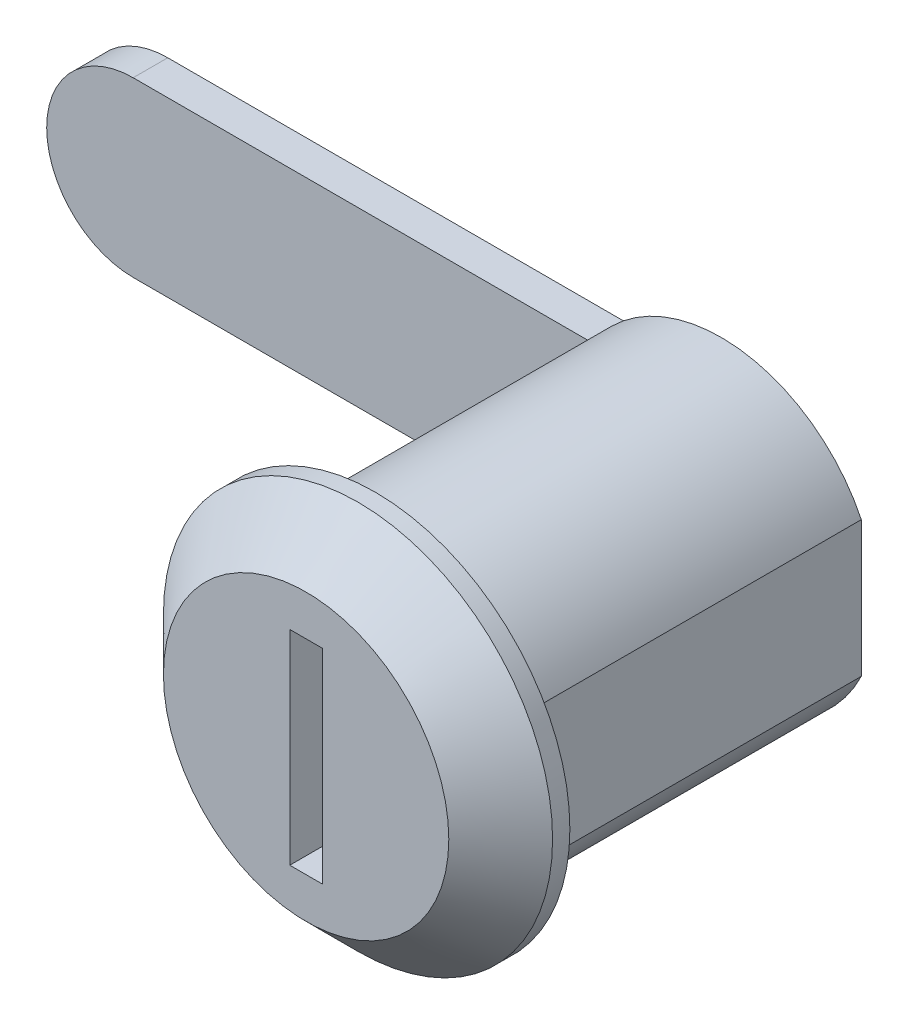
ISO-10303-21;
HEADER;
FILE_DESCRIPTION(('STEP AP214'),'2;1');
FILE_NAME('part.step','',(''),(''),'','','');
FILE_SCHEMA(('AUTOMOTIVE_DESIGN { 1 0 10303 214 1 1 1 1 }'));
ENDSEC;
DATA;
#1=APPLICATION_CONTEXT('core data for automotive mechanical design processes');
#2=APPLICATION_PROTOCOL_DEFINITION('international standard','automotive_design',2000,#1);
#3=PRODUCT_CONTEXT('',#1,'mechanical');
#4=PRODUCT('Part','Part','',(#3));
#5=PRODUCT_RELATED_PRODUCT_CATEGORY('part','',(#4));
#6=PRODUCT_DEFINITION_FORMATION('','',#4);
#7=PRODUCT_DEFINITION_CONTEXT('part definition',#1,'design');
#8=PRODUCT_DEFINITION('design','',#6,#7);
#9=PRODUCT_DEFINITION_SHAPE('','',#8);
#10=(LENGTH_UNIT() NAMED_UNIT(*) SI_UNIT(.MILLI.,.METRE.));
#11=(NAMED_UNIT(*) PLANE_ANGLE_UNIT() SI_UNIT($,.RADIAN.));
#12=(NAMED_UNIT(*) SI_UNIT($,.STERADIAN.) SOLID_ANGLE_UNIT());
#13=UNCERTAINTY_MEASURE_WITH_UNIT(LENGTH_MEASURE(1.E-05),#10,'distance_accuracy_value','');
#14=(GEOMETRIC_REPRESENTATION_CONTEXT(3) GLOBAL_UNCERTAINTY_ASSIGNED_CONTEXT((#13)) GLOBAL_UNIT_ASSIGNED_CONTEXT((#10,
#11,#12)) REPRESENTATION_CONTEXT('',''));
#15=CARTESIAN_POINT('',(0.,0.,0.));
#16=DIRECTION('',(0.,0.,1.));
#17=DIRECTION('',(1.,0.,0.));
#18=AXIS2_PLACEMENT_3D('',#15,#16,#17);
#19=CARTESIAN_POINT('',(0.,0.,0.));
#20=DIRECTION('',(0.,0.,1.));
#21=DIRECTION('',(1.,0.,0.));
#22=AXIS2_PLACEMENT_3D('',#19,#20,#21);
#23=PLANE('',#22);
#24=CARTESIAN_POINT('',(0.,0.,0.));
#25=DIRECTION('',(0.,0.,1.));
#26=DIRECTION('',(1.,0.,0.));
#27=AXIS2_PLACEMENT_3D('',#24,#25,#26);
#28=CIRCLE('',#27,11.25);
#29=CARTESIAN_POINT('',(11.25,0.,0.));
#30=VERTEX_POINT('',#29);
#31=EDGE_CURVE('E250',#30,#30,#28,.T.);
#32=ORIENTED_EDGE('',*,*,#31,.F.);
#33=EDGE_LOOP('',(#32));
#34=FACE_BOUND('',#33,.T.);
#35=CARTESIAN_POINT('',(0.,0.,0.));
#36=DIRECTION('',(0.,0.,-1.));
#37=DIRECTION('',(-1.,0.,0.));
#38=AXIS2_PLACEMENT_3D('',#35,#36,#37);
#39=CIRCLE('',#38,9.);
#40=CARTESIAN_POINT('',(8.1,-3.92300904918661,0.));
#41=VERTEX_POINT('',#40);
#42=CARTESIAN_POINT('',(-8.1,-3.92300904918661,0.));
#43=VERTEX_POINT('',#42);
#44=EDGE_CURVE('E161',#41,#43,#39,.T.);
#45=ORIENTED_EDGE('',*,*,#44,.F.);
#46=DIRECTION('',(0.,-1.,0.));
#47=VECTOR('',#46,1.);
#48=CARTESIAN_POINT('',(8.1,-3.92300904918661,0.));
#49=LINE('',#48,#47);
#50=CARTESIAN_POINT('',(8.1,3.92300904918661,0.));
#51=VERTEX_POINT('',#50);
#52=EDGE_CURVE('E196',#51,#41,#49,.T.);
#53=ORIENTED_EDGE('',*,*,#52,.F.);
#54=CARTESIAN_POINT('',(0.,0.,0.));
#55=DIRECTION('',(0.,0.,-1.));
#56=DIRECTION('',(-1.,0.,0.));
#57=AXIS2_PLACEMENT_3D('',#54,#55,#56);
#58=CIRCLE('',#57,9.);
#59=CARTESIAN_POINT('',(-8.1,3.92300904918661,0.));
#60=VERTEX_POINT('',#59);
#61=EDGE_CURVE('E192',#60,#51,#58,.T.);
#62=ORIENTED_EDGE('',*,*,#61,.F.);
#63=DIRECTION('',(0.,1.,0.));
#64=VECTOR('',#63,1.);
#65=CARTESIAN_POINT('',(-8.1,-3.92300904918661,0.));
#66=LINE('',#65,#64);
#67=EDGE_CURVE('E166',#43,#60,#66,.T.);
#68=ORIENTED_EDGE('',*,*,#67,.F.);
#69=EDGE_LOOP('',(#45,#53,#62,#68));
#70=FACE_BOUND('',#69,.T.);
#71=ADVANCED_FACE('F41',(#34,#70),#23,.F.);
#72=CARTESIAN_POINT('',(0.,0.,4.));
#73=DIRECTION('',(0.,0.,-1.));
#74=DIRECTION('',(-1.,0.,0.));
#75=AXIS2_PLACEMENT_3D('',#72,#73,#74);
#76=CYLINDRICAL_SURFACE('',#75,11.25);
#77=CARTESIAN_POINT('',(0.,0.,0.999999999999982));
#78=DIRECTION('',(0.,0.,1.));
#79=DIRECTION('',(1.,0.,0.));
#80=AXIS2_PLACEMENT_3D('',#77,#78,#79);
#81=CIRCLE('',#80,11.25);
#82=CARTESIAN_POINT('',(11.25,0.,0.999999999999982));
#83=VERTEX_POINT('',#82);
#84=EDGE_CURVE('E11',#83,#83,#81,.F.);
#85=ORIENTED_EDGE('',*,*,#84,.T.);
#86=EDGE_LOOP('',(#85));
#87=FACE_BOUND('',#86,.T.);
#88=ORIENTED_EDGE('',*,*,#31,.T.);
#89=EDGE_LOOP('',(#88));
#90=FACE_BOUND('',#89,.T.);
#91=ADVANCED_FACE('F305',(#87,#90),#76,.T.);
#92=CARTESIAN_POINT('',(0.,0.,4.));
#93=DIRECTION('',(0.,0.,1.));
#94=DIRECTION('',(1.,0.,0.));
#95=AXIS2_PLACEMENT_3D('',#92,#93,#94);
#96=PLANE('',#95);
#97=CARTESIAN_POINT('',(0.,0.,4.));
#98=DIRECTION('',(0.,0.,1.));
#99=DIRECTION('',(1.,0.,0.));
#100=AXIS2_PLACEMENT_3D('',#97,#98,#99);
#101=CIRCLE('',#100,8.24999999999999);
#102=CARTESIAN_POINT('',(8.24999999999999,0.,4.));
#103=VERTEX_POINT('',#102);
#104=EDGE_CURVE('E51',#103,#103,#101,.T.);
#105=ORIENTED_EDGE('',*,*,#104,.T.);
#106=EDGE_LOOP('',(#105));
#107=FACE_BOUND('',#106,.T.);
#108=DIRECTION('',(0.,1.,0.));
#109=VECTOR('',#108,1.);
#110=CARTESIAN_POINT('',(0.945004589681275,-5.90323373364755,4.));
#111=LINE('',#110,#109);
#112=CARTESIAN_POINT('',(0.945004589681275,-5.90323373364755,4.));
#113=VERTEX_POINT('',#112);
#114=CARTESIAN_POINT('',(0.945004589681275,5.90323373364754,4.));
#115=VERTEX_POINT('',#114);
#116=EDGE_CURVE('E215',#113,#115,#111,.T.);
#117=ORIENTED_EDGE('',*,*,#116,.F.);
#118=DIRECTION('',(1.,0.,0.));
#119=VECTOR('',#118,1.);
#120=CARTESIAN_POINT('',(-0.945004589681277,-5.90323373364755,4.));
#121=LINE('',#120,#119);
#122=CARTESIAN_POINT('',(-0.945004589681277,-5.90323373364755,4.));
#123=VERTEX_POINT('',#122);
#124=EDGE_CURVE('E221',#123,#113,#121,.T.);
#125=ORIENTED_EDGE('',*,*,#124,.F.);
#126=DIRECTION('',(0.,-1.,0.));
#127=VECTOR('',#126,1.);
#128=CARTESIAN_POINT('',(-0.945004589681277,-5.90323373364755,4.));
#129=LINE('',#128,#127);
#130=CARTESIAN_POINT('',(-0.945004589681277,5.90323373364754,4.));
#131=VERTEX_POINT('',#130);
#132=EDGE_CURVE('E240',#131,#123,#129,.T.);
#133=ORIENTED_EDGE('',*,*,#132,.F.);
#134=DIRECTION('',(-1.,0.,0.));
#135=VECTOR('',#134,1.);
#136=CARTESIAN_POINT('',(-0.945004589681277,5.90323373364754,4.));
#137=LINE('',#136,#135);
#138=EDGE_CURVE('E236',#115,#131,#137,.T.);
#139=ORIENTED_EDGE('',*,*,#138,.F.);
#140=EDGE_LOOP('',(#117,#125,#133,#139));
#141=FACE_BOUND('',#140,.T.);
#142=ADVANCED_FACE('F311',(#107,#141),#96,.T.);
#143=CARTESIAN_POINT('',(0.945004589681275,-5.90323373364755,2.));
#144=DIRECTION('',(1.,0.,0.));
#145=DIRECTION('',(0.,0.,-1.));
#146=AXIS2_PLACEMENT_3D('',#143,#144,#145);
#147=PLANE('',#146);
#148=ORIENTED_EDGE('',*,*,#116,.T.);
#149=DIRECTION('',(0.,0.,1.));
#150=VECTOR('',#149,1.);
#151=CARTESIAN_POINT('',(0.945004589681275,5.90323373364754,2.));
#152=LINE('',#151,#150);
#153=CARTESIAN_POINT('',(0.945004589681275,5.90323373364754,2.));
#154=VERTEX_POINT('',#153);
#155=EDGE_CURVE('E233',#154,#115,#152,.T.);
#156=ORIENTED_EDGE('',*,*,#155,.F.);
#157=DIRECTION('',(0.,1.,0.));
#158=VECTOR('',#157,1.);
#159=CARTESIAN_POINT('',(0.945004589681275,-5.90323373364755,2.));
#160=LINE('',#159,#158);
#161=CARTESIAN_POINT('',(0.945004589681275,-5.90323373364755,2.));
#162=VERTEX_POINT('',#161);
#163=EDGE_CURVE('E216',#162,#154,#160,.T.);
#164=ORIENTED_EDGE('',*,*,#163,.F.);
#165=DIRECTION('',(0.,0.,1.));
#166=VECTOR('',#165,1.);
#167=CARTESIAN_POINT('',(0.945004589681275,-5.90323373364755,2.));
#168=LINE('',#167,#166);
#169=EDGE_CURVE('E247',#162,#113,#168,.T.);
#170=ORIENTED_EDGE('',*,*,#169,.T.);
#171=EDGE_LOOP('',(#148,#156,#164,#170));
#172=FACE_BOUND('',#171,.T.);
#173=ADVANCED_FACE('F318',(#172),#147,.F.);
#174=CARTESIAN_POINT('',(-0.945004589681277,-5.90323373364755,2.));
#175=DIRECTION('',(0.,-1.,0.));
#176=DIRECTION('',(0.,0.,-1.));
#177=AXIS2_PLACEMENT_3D('',#174,#175,#176);
#178=PLANE('',#177);
#179=ORIENTED_EDGE('',*,*,#124,.T.);
#180=ORIENTED_EDGE('',*,*,#169,.F.);
#181=DIRECTION('',(1.,0.,0.));
#182=VECTOR('',#181,1.);
#183=CARTESIAN_POINT('',(-0.945004589681277,-5.90323373364755,2.));
#184=LINE('',#183,#182);
#185=CARTESIAN_POINT('',(-0.945004589681277,-5.90323373364755,2.));
#186=VERTEX_POINT('',#185);
#187=EDGE_CURVE('E229',#186,#162,#184,.T.);
#188=ORIENTED_EDGE('',*,*,#187,.F.);
#189=DIRECTION('',(0.,0.,1.));
#190=VECTOR('',#189,1.);
#191=CARTESIAN_POINT('',(-0.945004589681277,-5.90323373364755,2.));
#192=LINE('',#191,#190);
#193=EDGE_CURVE('E251',#186,#123,#192,.T.);
#194=ORIENTED_EDGE('',*,*,#193,.T.);
#195=EDGE_LOOP('',(#179,#180,#188,#194));
#196=FACE_BOUND('',#195,.T.);
#197=ADVANCED_FACE('F321',(#196),#178,.F.);
#198=CARTESIAN_POINT('',(-0.945004589681277,-5.90323373364755,2.));
#199=DIRECTION('',(-1.,0.,0.));
#200=DIRECTION('',(0.,0.,1.));
#201=AXIS2_PLACEMENT_3D('',#198,#199,#200);
#202=PLANE('',#201);
#203=ORIENTED_EDGE('',*,*,#132,.T.);
#204=ORIENTED_EDGE('',*,*,#193,.F.);
#205=DIRECTION('',(0.,-1.,0.));
#206=VECTOR('',#205,1.);
#207=CARTESIAN_POINT('',(-0.945004589681277,-5.90323373364755,2.));
#208=LINE('',#207,#206);
#209=CARTESIAN_POINT('',(-0.945004589681277,5.90323373364754,2.));
#210=VERTEX_POINT('',#209);
#211=EDGE_CURVE('E225',#210,#186,#208,.T.);
#212=ORIENTED_EDGE('',*,*,#211,.F.);
#213=DIRECTION('',(0.,0.,1.));
#214=VECTOR('',#213,1.);
#215=CARTESIAN_POINT('',(-0.945004589681277,5.90323373364754,2.));
#216=LINE('',#215,#214);
#217=EDGE_CURVE('E254',#210,#131,#216,.T.);
#218=ORIENTED_EDGE('',*,*,#217,.T.);
#219=EDGE_LOOP('',(#203,#204,#212,#218));
#220=FACE_BOUND('',#219,.T.);
#221=ADVANCED_FACE('F327',(#220),#202,.F.);
#222=CARTESIAN_POINT('',(-0.945004589681277,5.90323373364754,2.));
#223=DIRECTION('',(0.,1.,0.));
#224=DIRECTION('',(0.,0.,1.));
#225=AXIS2_PLACEMENT_3D('',#222,#223,#224);
#226=PLANE('',#225);
#227=ORIENTED_EDGE('',*,*,#138,.T.);
#228=ORIENTED_EDGE('',*,*,#217,.F.);
#229=DIRECTION('',(-1.,0.,0.));
#230=VECTOR('',#229,1.);
#231=CARTESIAN_POINT('',(-0.945004589681277,5.90323373364754,2.));
#232=LINE('',#231,#230);
#233=EDGE_CURVE('E220',#154,#210,#232,.T.);
#234=ORIENTED_EDGE('',*,*,#233,.F.);
#235=ORIENTED_EDGE('',*,*,#155,.T.);
#236=EDGE_LOOP('',(#227,#228,#234,#235));
#237=FACE_BOUND('',#236,.T.);
#238=ADVANCED_FACE('F323',(#237),#226,.F.);
#239=CARTESIAN_POINT('',(0.,0.,2.));
#240=DIRECTION('',(0.,0.,-1.));
#241=DIRECTION('',(-1.,0.,0.));
#242=AXIS2_PLACEMENT_3D('',#239,#240,#241);
#243=PLANE('',#242);
#244=ORIENTED_EDGE('',*,*,#163,.T.);
#245=ORIENTED_EDGE('',*,*,#233,.T.);
#246=ORIENTED_EDGE('',*,*,#211,.T.);
#247=ORIENTED_EDGE('',*,*,#187,.T.);
#248=EDGE_LOOP('',(#244,#245,#246,#247));
#249=FACE_BOUND('',#248,.T.);
#250=ADVANCED_FACE('F326',(#249),#243,.F.);
#251=CARTESIAN_POINT('',(0.,0.,-20.));
#252=DIRECTION('',(0.,0.,1.));
#253=DIRECTION('',(1.,0.,0.));
#254=AXIS2_PLACEMENT_3D('',#251,#252,#253);
#255=CYLINDRICAL_SURFACE('',#254,9.);
#256=ORIENTED_EDGE('',*,*,#44,.T.);
#257=DIRECTION('',(0.,0.,1.));
#258=VECTOR('',#257,1.);
#259=CARTESIAN_POINT('',(-8.1,-3.92300904918661,-20.));
#260=LINE('',#259,#258);
#261=CARTESIAN_POINT('',(-8.1,-3.92300904918661,-20.));
#262=VERTEX_POINT('',#261);
#263=EDGE_CURVE('E211',#262,#43,#260,.T.);
#264=ORIENTED_EDGE('',*,*,#263,.F.);
#265=CARTESIAN_POINT('',(0.,0.,-20.));
#266=DIRECTION('',(0.,0.,-1.));
#267=DIRECTION('',(-1.,0.,0.));
#268=AXIS2_PLACEMENT_3D('',#265,#266,#267);
#269=CIRCLE('',#268,9.);
#270=CARTESIAN_POINT('',(-7.48331477354788,-5.,-20.));
#271=VERTEX_POINT('',#270);
#272=EDGE_CURVE('E176',#271,#262,#269,.T.);
#273=ORIENTED_EDGE('',*,*,#272,.F.);
#274=CARTESIAN_POINT('',(8.1,-3.92300904918661,-20.));
#275=VERTEX_POINT('',#274);
#276=EDGE_CURVE('E172',#275,#271,#269,.T.);
#277=ORIENTED_EDGE('',*,*,#276,.F.);
#278=DIRECTION('',(0.,0.,1.));
#279=VECTOR('',#278,1.);
#280=CARTESIAN_POINT('',(8.1,-3.92300904918661,-20.));
#281=LINE('',#280,#279);
#282=EDGE_CURVE('E187',#275,#41,#281,.T.);
#283=ORIENTED_EDGE('',*,*,#282,.T.);
#284=EDGE_LOOP('',(#256,#264,#273,#277,#283));
#285=FACE_BOUND('',#284,.T.);
#286=ADVANCED_FACE('F337',(#285),#255,.T.);
#287=CARTESIAN_POINT('',(-8.1,-3.92300904918661,-20.));
#288=DIRECTION('',(1.,0.,0.));
#289=DIRECTION('',(0.,0.,-1.));
#290=AXIS2_PLACEMENT_3D('',#287,#288,#289);
#291=PLANE('',#290);
#292=ORIENTED_EDGE('',*,*,#67,.T.);
#293=DIRECTION('',(0.,0.,1.));
#294=VECTOR('',#293,1.);
#295=CARTESIAN_POINT('',(-8.1,3.92300904918661,-20.));
#296=LINE('',#295,#294);
#297=CARTESIAN_POINT('',(-8.1,3.92300904918661,-20.));
#298=VERTEX_POINT('',#297);
#299=EDGE_CURVE('E207',#298,#60,#296,.T.);
#300=ORIENTED_EDGE('',*,*,#299,.F.);
#301=DIRECTION('',(0.,1.,0.));
#302=VECTOR('',#301,1.);
#303=CARTESIAN_POINT('',(-8.1,-3.92300904918661,-20.));
#304=LINE('',#303,#302);
#305=EDGE_CURVE('E175',#262,#298,#304,.T.);
#306=ORIENTED_EDGE('',*,*,#305,.F.);
#307=ORIENTED_EDGE('',*,*,#263,.T.);
#308=EDGE_LOOP('',(#292,#300,#306,#307));
#309=FACE_BOUND('',#308,.T.);
#310=ADVANCED_FACE('F341',(#309),#291,.F.);
#311=CARTESIAN_POINT('',(0.,0.,-20.));
#312=DIRECTION('',(0.,0.,1.));
#313=DIRECTION('',(1.,0.,0.));
#314=AXIS2_PLACEMENT_3D('',#311,#312,#313);
#315=CYLINDRICAL_SURFACE('',#314,9.);
#316=ORIENTED_EDGE('',*,*,#61,.T.);
#317=DIRECTION('',(0.,0.,1.));
#318=VECTOR('',#317,1.);
#319=CARTESIAN_POINT('',(8.1,3.92300904918661,-20.));
#320=LINE('',#319,#318);
#321=CARTESIAN_POINT('',(8.1,3.92300904918661,-20.));
#322=VERTEX_POINT('',#321);
#323=EDGE_CURVE('E203',#322,#51,#320,.T.);
#324=ORIENTED_EDGE('',*,*,#323,.F.);
#325=CARTESIAN_POINT('',(0.,0.,-20.));
#326=DIRECTION('',(0.,0.,-1.));
#327=DIRECTION('',(-1.,0.,0.));
#328=AXIS2_PLACEMENT_3D('',#325,#326,#327);
#329=CIRCLE('',#328,9.);
#330=CARTESIAN_POINT('',(-7.48331477354788,5.,-20.));
#331=VERTEX_POINT('',#330);
#332=EDGE_CURVE('E180',#331,#322,#329,.T.);
#333=ORIENTED_EDGE('',*,*,#332,.F.);
#334=EDGE_CURVE('E181',#298,#331,#329,.T.);
#335=ORIENTED_EDGE('',*,*,#334,.F.);
#336=ORIENTED_EDGE('',*,*,#299,.T.);
#337=EDGE_LOOP('',(#316,#324,#333,#335,#336));
#338=FACE_BOUND('',#337,.T.);
#339=ADVANCED_FACE('F345',(#338),#315,.T.);
#340=CARTESIAN_POINT('',(8.1,-3.92300904918661,-20.));
#341=DIRECTION('',(-1.,0.,0.));
#342=DIRECTION('',(0.,0.,1.));
#343=AXIS2_PLACEMENT_3D('',#340,#341,#342);
#344=PLANE('',#343);
#345=ORIENTED_EDGE('',*,*,#52,.T.);
#346=ORIENTED_EDGE('',*,*,#282,.F.);
#347=DIRECTION('',(0.,-1.,0.));
#348=VECTOR('',#347,1.);
#349=CARTESIAN_POINT('',(8.1,-3.92300904918661,-20.));
#350=LINE('',#349,#348);
#351=EDGE_CURVE('E185',#322,#275,#350,.T.);
#352=ORIENTED_EDGE('',*,*,#351,.F.);
#353=ORIENTED_EDGE('',*,*,#323,.T.);
#354=EDGE_LOOP('',(#345,#346,#352,#353));
#355=FACE_BOUND('',#354,.T.);
#356=ADVANCED_FACE('F349',(#355),#344,.F.);
#357=CARTESIAN_POINT('',(0.,0.,-20.));
#358=DIRECTION('',(0.,0.,-1.));
#359=DIRECTION('',(-1.,0.,0.));
#360=AXIS2_PLACEMENT_3D('',#357,#358,#359);
#361=PLANE('',#360);
#362=DIRECTION('',(1.,0.,0.));
#363=VECTOR('',#362,1.);
#364=CARTESIAN_POINT('',(0.,5.,-20.));
#365=LINE('',#364,#363);
#366=CARTESIAN_POINT('',(0.,5.,-20.));
#367=VERTEX_POINT('',#366);
#368=EDGE_CURVE('E262',#331,#367,#365,.T.);
#369=ORIENTED_EDGE('',*,*,#368,.F.);
#370=ORIENTED_EDGE('',*,*,#332,.T.);
#371=ORIENTED_EDGE('',*,*,#351,.T.);
#372=ORIENTED_EDGE('',*,*,#276,.T.);
#373=DIRECTION('',(-1.,0.,0.));
#374=VECTOR('',#373,1.);
#375=CARTESIAN_POINT('',(0.,-5.,-20.));
#376=LINE('',#375,#374);
#377=CARTESIAN_POINT('',(0.,-5.,-20.));
#378=VERTEX_POINT('',#377);
#379=EDGE_CURVE('E63',#378,#271,#376,.T.);
#380=ORIENTED_EDGE('',*,*,#379,.F.);
#381=CARTESIAN_POINT('',(0.,0.,-20.));
#382=DIRECTION('',(0.,0.,-1.));
#383=DIRECTION('',(-1.,0.,0.));
#384=AXIS2_PLACEMENT_3D('',#381,#382,#383);
#385=CIRCLE('',#384,5.);
#386=EDGE_CURVE('E58',#367,#378,#385,.T.);
#387=ORIENTED_EDGE('',*,*,#386,.F.);
#388=EDGE_LOOP('',(#369,#370,#371,#372,#380,#387));
#389=FACE_BOUND('',#388,.T.);
#390=ADVANCED_FACE('F353',(#389),#361,.T.);
#391=CARTESIAN_POINT('',(0.,0.,-20.));
#392=DIRECTION('',(0.,0.,-1.));
#393=DIRECTION('',(-1.,0.,0.));
#394=AXIS2_PLACEMENT_3D('',#391,#392,#393);
#395=PLANE('',#394);
#396=CARTESIAN_POINT('',(-34.,-5.,-20.));
#397=VERTEX_POINT('',#396);
#398=EDGE_CURVE('E282',#271,#397,#376,.T.);
#399=ORIENTED_EDGE('',*,*,#398,.F.);
#400=ORIENTED_EDGE('',*,*,#272,.T.);
#401=ORIENTED_EDGE('',*,*,#305,.T.);
#402=ORIENTED_EDGE('',*,*,#334,.T.);
#403=CARTESIAN_POINT('',(-34.,5.,-20.));
#404=VERTEX_POINT('',#403);
#405=EDGE_CURVE('E157',#404,#331,#365,.T.);
#406=ORIENTED_EDGE('',*,*,#405,.F.);
#407=CARTESIAN_POINT('',(-34.,0.,-20.));
#408=DIRECTION('',(0.,0.,-1.));
#409=DIRECTION('',(-1.,0.,0.));
#410=AXIS2_PLACEMENT_3D('',#407,#408,#409);
#411=CIRCLE('',#410,5.);
#412=EDGE_CURVE('E274',#397,#404,#411,.T.);
#413=ORIENTED_EDGE('',*,*,#412,.F.);
#414=EDGE_LOOP('',(#399,#400,#401,#402,#406,#413));
#415=FACE_BOUND('',#414,.T.);
#416=ADVANCED_FACE('F357',(#415),#395,.F.);
#417=CARTESIAN_POINT('',(0.,0.,-22.));
#418=DIRECTION('',(0.,0.,1.));
#419=DIRECTION('',(1.,0.,0.));
#420=AXIS2_PLACEMENT_3D('',#417,#418,#419);
#421=CYLINDRICAL_SURFACE('',#420,5.);
#422=ORIENTED_EDGE('',*,*,#386,.T.);
#423=DIRECTION('',(0.,0.,1.));
#424=VECTOR('',#423,1.);
#425=CARTESIAN_POINT('',(0.,-5.,-22.));
#426=LINE('',#425,#424);
#427=CARTESIAN_POINT('',(0.,-5.,-22.));
#428=VERTEX_POINT('',#427);
#429=EDGE_CURVE('E140',#428,#378,#426,.T.);
#430=ORIENTED_EDGE('',*,*,#429,.F.);
#431=CARTESIAN_POINT('',(0.,0.,-22.));
#432=DIRECTION('',(0.,0.,-1.));
#433=DIRECTION('',(-1.,0.,0.));
#434=AXIS2_PLACEMENT_3D('',#431,#432,#433);
#435=CIRCLE('',#434,5.);
#436=CARTESIAN_POINT('',(0.,5.,-22.));
#437=VERTEX_POINT('',#436);
#438=EDGE_CURVE('E147',#437,#428,#435,.T.);
#439=ORIENTED_EDGE('',*,*,#438,.F.);
#440=DIRECTION('',(0.,0.,1.));
#441=VECTOR('',#440,1.);
#442=CARTESIAN_POINT('',(0.,5.,-22.));
#443=LINE('',#442,#441);
#444=EDGE_CURVE('E289',#437,#367,#443,.T.);
#445=ORIENTED_EDGE('',*,*,#444,.T.);
#446=EDGE_LOOP('',(#422,#430,#439,#445));
#447=FACE_BOUND('',#446,.T.);
#448=ADVANCED_FACE('F159',(#447),#421,.T.);
#449=CARTESIAN_POINT('',(0.,-5.,-22.));
#450=DIRECTION('',(0.,1.,0.));
#451=DIRECTION('',(0.,0.,1.));
#452=AXIS2_PLACEMENT_3D('',#449,#450,#451);
#453=PLANE('',#452);
#454=ORIENTED_EDGE('',*,*,#379,.T.);
#455=ORIENTED_EDGE('',*,*,#398,.T.);
#456=DIRECTION('',(0.,0.,1.));
#457=VECTOR('',#456,1.);
#458=CARTESIAN_POINT('',(-34.,-5.,-22.));
#459=LINE('',#458,#457);
#460=CARTESIAN_POINT('',(-34.,-5.,-22.));
#461=VERTEX_POINT('',#460);
#462=EDGE_CURVE('E142',#461,#397,#459,.T.);
#463=ORIENTED_EDGE('',*,*,#462,.F.);
#464=DIRECTION('',(-1.,0.,0.));
#465=VECTOR('',#464,1.);
#466=CARTESIAN_POINT('',(0.,-5.,-22.));
#467=LINE('',#466,#465);
#468=EDGE_CURVE('E136',#428,#461,#467,.T.);
#469=ORIENTED_EDGE('',*,*,#468,.F.);
#470=ORIENTED_EDGE('',*,*,#429,.T.);
#471=EDGE_LOOP('',(#454,#455,#463,#469,#470));
#472=FACE_BOUND('',#471,.T.);
#473=ADVANCED_FACE('F138',(#472),#453,.F.);
#474=CARTESIAN_POINT('',(-34.,0.,-22.));
#475=DIRECTION('',(0.,0.,1.));
#476=DIRECTION('',(1.,0.,0.));
#477=AXIS2_PLACEMENT_3D('',#474,#475,#476);
#478=CYLINDRICAL_SURFACE('',#477,5.);
#479=ORIENTED_EDGE('',*,*,#412,.T.);
#480=DIRECTION('',(0.,0.,1.));
#481=VECTOR('',#480,1.);
#482=CARTESIAN_POINT('',(-34.,5.,-22.));
#483=LINE('',#482,#481);
#484=CARTESIAN_POINT('',(-34.,5.,-22.));
#485=VERTEX_POINT('',#484);
#486=EDGE_CURVE('E168',#485,#404,#483,.T.);
#487=ORIENTED_EDGE('',*,*,#486,.F.);
#488=CARTESIAN_POINT('',(-34.,0.,-22.));
#489=DIRECTION('',(0.,0.,-1.));
#490=DIRECTION('',(-1.,0.,0.));
#491=AXIS2_PLACEMENT_3D('',#488,#489,#490);
#492=CIRCLE('',#491,5.);
#493=EDGE_CURVE('E146',#461,#485,#492,.T.);
#494=ORIENTED_EDGE('',*,*,#493,.F.);
#495=ORIENTED_EDGE('',*,*,#462,.T.);
#496=EDGE_LOOP('',(#479,#487,#494,#495));
#497=FACE_BOUND('',#496,.T.);
#498=ADVANCED_FACE('F291',(#497),#478,.T.);
#499=CARTESIAN_POINT('',(0.,5.,-22.));
#500=DIRECTION('',(0.,-1.,0.));
#501=DIRECTION('',(0.,0.,-1.));
#502=AXIS2_PLACEMENT_3D('',#499,#500,#501);
#503=PLANE('',#502);
#504=ORIENTED_EDGE('',*,*,#405,.T.);
#505=ORIENTED_EDGE('',*,*,#368,.T.);
#506=ORIENTED_EDGE('',*,*,#444,.F.);
#507=DIRECTION('',(1.,0.,0.));
#508=VECTOR('',#507,1.);
#509=CARTESIAN_POINT('',(0.,5.,-22.));
#510=LINE('',#509,#508);
#511=EDGE_CURVE('E152',#485,#437,#510,.T.);
#512=ORIENTED_EDGE('',*,*,#511,.F.);
#513=ORIENTED_EDGE('',*,*,#486,.T.);
#514=EDGE_LOOP('',(#504,#505,#506,#512,#513));
#515=FACE_BOUND('',#514,.T.);
#516=ADVANCED_FACE('F293',(#515),#503,.F.);
#517=CARTESIAN_POINT('',(0.,0.,-22.));
#518=DIRECTION('',(0.,0.,-1.));
#519=DIRECTION('',(-1.,0.,0.));
#520=AXIS2_PLACEMENT_3D('',#517,#518,#519);
#521=PLANE('',#520);
#522=ORIENTED_EDGE('',*,*,#438,.T.);
#523=ORIENTED_EDGE('',*,*,#468,.T.);
#524=ORIENTED_EDGE('',*,*,#493,.T.);
#525=ORIENTED_EDGE('',*,*,#511,.T.);
#526=EDGE_LOOP('',(#522,#523,#524,#525));
#527=FACE_BOUND('',#526,.T.);
#528=ADVANCED_FACE('F150',(#527),#521,.T.);
#529=CARTESIAN_POINT('',(0.,0.,4.));
#530=DIRECTION('',(0.,0.,-1.));
#531=DIRECTION('',(-1.,0.,0.));
#532=AXIS2_PLACEMENT_3D('',#529,#530,#531);
#533=CONICAL_SURFACE('',#532,8.24999999999999,0.785398163397446);
#534=ORIENTED_EDGE('',*,*,#84,.F.);
#535=EDGE_LOOP('',(#534));
#536=FACE_BOUND('',#535,.T.);
#537=ORIENTED_EDGE('',*,*,#104,.F.);
#538=EDGE_LOOP('',(#537));
#539=FACE_BOUND('',#538,.T.);
#540=ADVANCED_FACE('F44',(#536,#539),#533,.T.);
#541=CLOSED_SHELL('',(#71,#91,#142,#173,#197,#221,#238,#250,#286,#310,#339,#356,#390,#416,#448,
#473,#498,#516,#528,#540));
#542=MANIFOLD_SOLID_BREP('B2',#541);
#543=ADVANCED_BREP_SHAPE_REPRESENTATION('',(#18,#542),#14);
#544=SHAPE_DEFINITION_REPRESENTATION(#9,#543);
ENDSEC;
END-ISO-10303-21;
